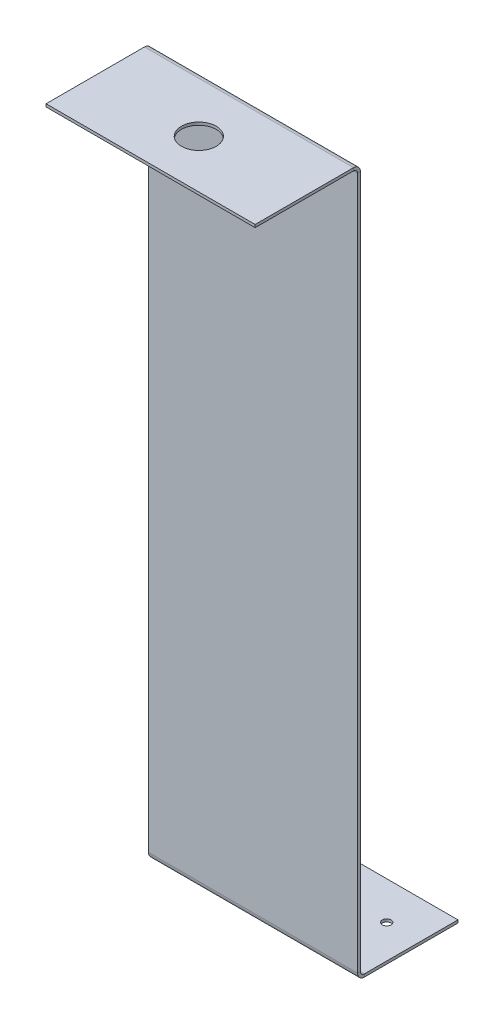
ISO-10303-21;
HEADER;
FILE_DESCRIPTION(('STEP AP214'),'2;1');
FILE_NAME('part.step','',(''),(''),'','','');
FILE_SCHEMA(('AUTOMOTIVE_DESIGN { 1 0 10303 214 1 1 1 1 }'));
ENDSEC;
DATA;
#1=APPLICATION_CONTEXT('core data for automotive mechanical design processes');
#2=APPLICATION_PROTOCOL_DEFINITION('international standard','automotive_design',2000,#1);
#3=PRODUCT_CONTEXT('',#1,'mechanical');
#4=PRODUCT('Part','Part','',(#3));
#5=PRODUCT_RELATED_PRODUCT_CATEGORY('part','',(#4));
#6=PRODUCT_DEFINITION_FORMATION('','',#4);
#7=PRODUCT_DEFINITION_CONTEXT('part definition',#1,'design');
#8=PRODUCT_DEFINITION('design','',#6,#7);
#9=PRODUCT_DEFINITION_SHAPE('','',#8);
#10=(LENGTH_UNIT() NAMED_UNIT(*) SI_UNIT(.MILLI.,.METRE.));
#11=(NAMED_UNIT(*) PLANE_ANGLE_UNIT() SI_UNIT($,.RADIAN.));
#12=(NAMED_UNIT(*) SI_UNIT($,.STERADIAN.) SOLID_ANGLE_UNIT());
#13=UNCERTAINTY_MEASURE_WITH_UNIT(LENGTH_MEASURE(1.E-05),#10,'distance_accuracy_value','');
#14=(GEOMETRIC_REPRESENTATION_CONTEXT(3) GLOBAL_UNCERTAINTY_ASSIGNED_CONTEXT((#13)) GLOBAL_UNIT_ASSIGNED_CONTEXT((#10,
#11,#12)) REPRESENTATION_CONTEXT('',''));
#15=CARTESIAN_POINT('',(0.,0.,0.));
#16=DIRECTION('',(0.,0.,1.));
#17=DIRECTION('',(1.,0.,0.));
#18=AXIS2_PLACEMENT_3D('',#15,#16,#17);
#19=CARTESIAN_POINT('',(-19.0500000000001,51.5620000000003,75.7803383173531));
#20=DIRECTION('',(0.,0.,1.));
#21=DIRECTION('',(0.,-1.,0.));
#22=AXIS2_PLACEMENT_3D('',#19,#20,#21);
#23=PLANE('',#22);
#24=DIRECTION('',(1.,0.,0.));
#25=VECTOR('',#24,1.);
#26=CARTESIAN_POINT('',(-19.0500000000001,52.0700000000003,75.7803383173531));
#27=LINE('',#26,#25);
#28=CARTESIAN_POINT('',(-19.0500000000001,52.0700000000003,75.7803383173531));
#29=VERTEX_POINT('',#28);
#30=CARTESIAN_POINT('',(19.0499999999999,52.0700000000003,75.7803383173531));
#31=VERTEX_POINT('',#30);
#32=EDGE_CURVE('E299',#29,#31,#27,.T.);
#33=ORIENTED_EDGE('',*,*,#32,.F.);
#34=DIRECTION('',(0.,1.,0.));
#35=VECTOR('',#34,1.);
#36=CARTESIAN_POINT('',(-19.0500000000001,51.5620000000003,75.7803383173531));
#37=LINE('',#36,#35);
#38=CARTESIAN_POINT('',(-19.0500000000001,51.5620000000003,75.7803383173531));
#39=VERTEX_POINT('',#38);
#40=EDGE_CURVE('E284',#39,#29,#37,.T.);
#41=ORIENTED_EDGE('',*,*,#40,.F.);
#42=DIRECTION('',(1.,0.,0.));
#43=VECTOR('',#42,1.);
#44=CARTESIAN_POINT('',(-19.0500000000001,51.5620000000003,75.7803383173531));
#45=LINE('',#44,#43);
#46=CARTESIAN_POINT('',(19.0499999999999,51.5620000000003,75.7803383173531));
#47=VERTEX_POINT('',#46);
#48=EDGE_CURVE('E312',#39,#47,#45,.T.);
#49=ORIENTED_EDGE('',*,*,#48,.T.);
#50=DIRECTION('',(0.,1.,0.));
#51=VECTOR('',#50,1.);
#52=CARTESIAN_POINT('',(19.0499999999999,51.5620000000003,75.7803383173531));
#53=LINE('',#52,#51);
#54=EDGE_CURVE('E311',#47,#31,#53,.T.);
#55=ORIENTED_EDGE('',*,*,#54,.T.);
#56=EDGE_LOOP('',(#33,#41,#49,#55));
#57=FACE_BOUND('',#56,.T.);
#58=ADVANCED_FACE('F67',(#57),#23,.T.);
#59=CARTESIAN_POINT('',(0.,51.5619999999993,-203.619661682647));
#60=DIRECTION('',(0.,-1.,0.));
#61=DIRECTION('',(-1.,0.,0.));
#62=AXIS2_PLACEMENT_3D('',#59,#60,#61);
#63=PLANE('',#62);
#64=CARTESIAN_POINT('',(0.,51.5620000000003,66.9891845793376));
#65=DIRECTION('',(0.,-1.,0.));
#66=DIRECTION('',(0.,0.,-1.));
#67=AXIS2_PLACEMENT_3D('',#64,#65,#66);
#68=CIRCLE('',#67,3.175);
#69=CARTESIAN_POINT('',(0.,51.5620000000002,63.8141845793376));
#70=VERTEX_POINT('',#69);
#71=EDGE_CURVE('E169',#70,#70,#68,.T.);
#72=ORIENTED_EDGE('',*,*,#71,.F.);
#73=EDGE_LOOP('',(#72));
#74=FACE_BOUND('',#73,.T.);
#75=DIRECTION('',(0.,0.,1.));
#76=VECTOR('',#75,1.);
#77=CARTESIAN_POINT('',(-19.0500000000001,51.5620000000003,75.7803383173531));
#78=LINE('',#77,#76);
#79=CARTESIAN_POINT('',(-19.0500000000001,51.5620000000002,57.8451845793376));
#80=VERTEX_POINT('',#79);
#81=EDGE_CURVE('E286',#80,#39,#78,.T.);
#82=ORIENTED_EDGE('',*,*,#81,.F.);
#83=DIRECTION('',(1.,0.,0.));
#84=VECTOR('',#83,1.);
#85=CARTESIAN_POINT('',(1.67542816975816E-13,51.5620000000002,57.8451845793376));
#86=LINE('',#85,#84);
#87=CARTESIAN_POINT('',(19.0499999999999,51.5620000000002,57.8451845793376));
#88=VERTEX_POINT('',#87);
#89=EDGE_CURVE('E275',#80,#88,#86,.T.);
#90=ORIENTED_EDGE('',*,*,#89,.T.);
#91=DIRECTION('',(0.,0.,-1.));
#92=VECTOR('',#91,1.);
#93=CARTESIAN_POINT('',(19.0499999999999,51.5620000000003,75.7803383173531));
#94=LINE('',#93,#92);
#95=EDGE_CURVE('E307',#47,#88,#94,.T.);
#96=ORIENTED_EDGE('',*,*,#95,.F.);
#97=ORIENTED_EDGE('',*,*,#48,.F.);
#98=EDGE_LOOP('',(#82,#90,#96,#97));
#99=FACE_BOUND('',#98,.T.);
#100=ADVANCED_FACE('F364',(#74,#99),#63,.T.);
#101=CARTESIAN_POINT('',(19.0499999999999,51.5620000000003,75.7803383173531));
#102=DIRECTION('',(1.,0.,0.));
#103=DIRECTION('',(0.,-1.,0.));
#104=AXIS2_PLACEMENT_3D('',#101,#102,#103);
#105=PLANE('',#104);
#106=ORIENTED_EDGE('',*,*,#95,.T.);
#107=DIRECTION('',(0.,1.,0.));
#108=VECTOR('',#107,1.);
#109=CARTESIAN_POINT('',(19.0499999999999,51.5620000000003,57.8451845793376));
#110=LINE('',#109,#108);
#111=CARTESIAN_POINT('',(19.0499999999999,52.0700000000002,57.8451845793376));
#112=VERTEX_POINT('',#111);
#113=EDGE_CURVE('E304',#88,#112,#110,.T.);
#114=ORIENTED_EDGE('',*,*,#113,.T.);
#115=DIRECTION('',(0.,0.,-1.));
#116=VECTOR('',#115,1.);
#117=CARTESIAN_POINT('',(19.0499999999999,52.0700000000003,75.7803383173531));
#118=LINE('',#117,#116);
#119=EDGE_CURVE('E297',#31,#112,#118,.T.);
#120=ORIENTED_EDGE('',*,*,#119,.F.);
#121=ORIENTED_EDGE('',*,*,#54,.F.);
#122=EDGE_LOOP('',(#106,#114,#120,#121));
#123=FACE_BOUND('',#122,.T.);
#124=ADVANCED_FACE('F369',(#123),#105,.T.);
#125=CARTESIAN_POINT('',(-19.0500000000001,51.5620000000003,75.7803383173531));
#126=DIRECTION('',(-1.,0.,0.));
#127=DIRECTION('',(0.,1.,0.));
#128=AXIS2_PLACEMENT_3D('',#125,#126,#127);
#129=PLANE('',#128);
#130=DIRECTION('',(0.,0.,1.));
#131=VECTOR('',#130,1.);
#132=CARTESIAN_POINT('',(-19.0500000000001,52.0700000000003,75.7803383173531));
#133=LINE('',#132,#131);
#134=CARTESIAN_POINT('',(-19.0500000000001,52.0700000000002,57.8451845793376));
#135=VERTEX_POINT('',#134);
#136=EDGE_CURVE('E302',#135,#29,#133,.T.);
#137=ORIENTED_EDGE('',*,*,#136,.F.);
#138=DIRECTION('',(0.,-1.,0.));
#139=VECTOR('',#138,1.);
#140=CARTESIAN_POINT('',(-19.0500000000001,51.5620000000004,57.8451845793376));
#141=LINE('',#140,#139);
#142=EDGE_CURVE('E291',#135,#80,#141,.T.);
#143=ORIENTED_EDGE('',*,*,#142,.T.);
#144=ORIENTED_EDGE('',*,*,#81,.T.);
#145=ORIENTED_EDGE('',*,*,#40,.T.);
#146=EDGE_LOOP('',(#137,#143,#144,#145));
#147=FACE_BOUND('',#146,.T.);
#148=ADVANCED_FACE('F375',(#147),#129,.T.);
#149=CARTESIAN_POINT('',(0.,52.0699999999993,-203.619661682647));
#150=DIRECTION('',(0.,-1.,0.));
#151=DIRECTION('',(-1.,0.,0.));
#152=AXIS2_PLACEMENT_3D('',#149,#150,#151);
#153=PLANE('',#152);
#154=CARTESIAN_POINT('',(0.,52.0700000000004,66.9891845793376));
#155=DIRECTION('',(0.,1.,0.));
#156=DIRECTION('',(0.,0.,1.));
#157=AXIS2_PLACEMENT_3D('',#154,#155,#156);
#158=CIRCLE('',#157,3.175);
#159=CARTESIAN_POINT('',(0.,52.0700000000004,70.1641845793376));
#160=VERTEX_POINT('',#159);
#161=EDGE_CURVE('E330',#160,#160,#158,.T.);
#162=ORIENTED_EDGE('',*,*,#161,.F.);
#163=EDGE_LOOP('',(#162));
#164=FACE_BOUND('',#163,.T.);
#165=DIRECTION('',(1.,0.,0.));
#166=VECTOR('',#165,1.);
#167=CARTESIAN_POINT('',(1.67727854146586E-13,52.0700000000002,57.8451845793376));
#168=LINE('',#167,#166);
#169=EDGE_CURVE('E281',#135,#112,#168,.T.);
#170=ORIENTED_EDGE('',*,*,#169,.F.);
#171=ORIENTED_EDGE('',*,*,#136,.T.);
#172=ORIENTED_EDGE('',*,*,#32,.T.);
#173=ORIENTED_EDGE('',*,*,#119,.T.);
#174=EDGE_LOOP('',(#170,#171,#172,#173));
#175=FACE_BOUND('',#174,.T.);
#176=ADVANCED_FACE('F377',(#164,#175),#153,.F.);
#177=CARTESIAN_POINT('',(38.1351451548194,50.8254000000002,57.8451845793375));
#178=DIRECTION('',(-1.,0.,0.));
#179=DIRECTION('',(0.,0.,1.));
#180=AXIS2_PLACEMENT_3D('',#177,#178,#179);
#181=CYLINDRICAL_SURFACE('',#180,0.7366);
#182=DIRECTION('',(1.,0.,0.));
#183=VECTOR('',#182,1.);
#184=CARTESIAN_POINT('',(1.6780679187286E-13,50.8254000000002,57.1085845793376));
#185=LINE('',#184,#183);
#186=CARTESIAN_POINT('',(-19.0500000000001,50.8254000000002,57.1085845793376));
#187=VERTEX_POINT('',#186);
#188=CARTESIAN_POINT('',(19.0499999999999,50.8254000000002,57.1085845793376));
#189=VERTEX_POINT('',#188);
#190=EDGE_CURVE('E182',#187,#189,#185,.T.);
#191=ORIENTED_EDGE('',*,*,#190,.T.);
#192=CARTESIAN_POINT('',(19.0499999999999,50.8254000000002,57.8451845793376));
#193=DIRECTION('',(1.,0.,0.));
#194=DIRECTION('',(0.,0.,1.));
#195=AXIS2_PLACEMENT_3D('',#192,#193,#194);
#196=CIRCLE('',#195,0.736599999999997);
#197=EDGE_CURVE('E220',#189,#88,#196,.T.);
#198=ORIENTED_EDGE('',*,*,#197,.T.);
#199=ORIENTED_EDGE('',*,*,#89,.F.);
#200=CARTESIAN_POINT('',(-19.0500000000001,50.8254000000002,57.8451845793376));
#201=DIRECTION('',(-1.,0.,0.));
#202=DIRECTION('',(0.,0.,-1.));
#203=AXIS2_PLACEMENT_3D('',#200,#201,#202);
#204=CIRCLE('',#203,0.736599999999993);
#205=EDGE_CURVE('E269',#80,#187,#204,.T.);
#206=ORIENTED_EDGE('',*,*,#205,.T.);
#207=EDGE_LOOP('',(#191,#198,#199,#206));
#208=FACE_BOUND('',#207,.T.);
#209=ADVANCED_FACE('F274',(#208),#181,.F.);
#210=CARTESIAN_POINT('',(19.0499999999999,50.8254000000002,57.8451845793376));
#211=DIRECTION('',(-1.,0.,0.));
#212=DIRECTION('',(0.,0.,1.));
#213=AXIS2_PLACEMENT_3D('',#210,#211,#212);
#214=PLANE('',#213);
#215=CARTESIAN_POINT('',(19.0499999999999,50.8254000000002,57.8451845793376));
#216=DIRECTION('',(-1.,0.,0.));
#217=DIRECTION('',(0.,0.,1.));
#218=AXIS2_PLACEMENT_3D('',#215,#216,#217);
#219=CIRCLE('',#218,1.2446);
#220=CARTESIAN_POINT('',(19.0499999999999,50.8254000000002,56.6005845793376));
#221=VERTEX_POINT('',#220);
#222=EDGE_CURVE('E276',#221,#112,#219,.F.);
#223=ORIENTED_EDGE('',*,*,#222,.T.);
#224=ORIENTED_EDGE('',*,*,#113,.F.);
#225=ORIENTED_EDGE('',*,*,#197,.F.);
#226=DIRECTION('',(0.,0.,-1.));
#227=VECTOR('',#226,1.);
#228=CARTESIAN_POINT('',(19.0499999999999,50.8254000000002,57.1085845793374));
#229=LINE('',#228,#227);
#230=EDGE_CURVE('E185',#189,#221,#229,.T.);
#231=ORIENTED_EDGE('',*,*,#230,.T.);
#232=EDGE_LOOP('',(#223,#224,#225,#231));
#233=FACE_BOUND('',#232,.T.);
#234=ADVANCED_FACE('F385',(#233),#214,.F.);
#235=CARTESIAN_POINT('',(-19.0500000000001,50.8254000000002,57.8451845793376));
#236=DIRECTION('',(1.,0.,0.));
#237=DIRECTION('',(0.,0.,-1.));
#238=AXIS2_PLACEMENT_3D('',#235,#236,#237);
#239=PLANE('',#238);
#240=ORIENTED_EDGE('',*,*,#142,.F.);
#241=CARTESIAN_POINT('',(-19.0500000000001,50.8254000000002,57.8451845793376));
#242=DIRECTION('',(-1.,0.,0.));
#243=DIRECTION('',(0.,0.,1.));
#244=AXIS2_PLACEMENT_3D('',#241,#242,#243);
#245=CIRCLE('',#244,1.2446);
#246=CARTESIAN_POINT('',(-19.0500000000001,50.8254000000002,56.6005845793376));
#247=VERTEX_POINT('',#246);
#248=EDGE_CURVE('E271',#135,#247,#245,.T.);
#249=ORIENTED_EDGE('',*,*,#248,.T.);
#250=DIRECTION('',(0.,0.,1.));
#251=VECTOR('',#250,1.);
#252=CARTESIAN_POINT('',(-19.0500000000001,50.8254000000002,57.1085845793375));
#253=LINE('',#252,#251);
#254=EDGE_CURVE('E75',#247,#187,#253,.T.);
#255=ORIENTED_EDGE('',*,*,#254,.T.);
#256=ORIENTED_EDGE('',*,*,#205,.F.);
#257=EDGE_LOOP('',(#240,#249,#255,#256));
#258=FACE_BOUND('',#257,.T.);
#259=ADVANCED_FACE('F268',(#258),#239,.F.);
#260=CARTESIAN_POINT('',(38.1351451548194,50.8254000000002,57.8451845793375));
#261=DIRECTION('',(-1.,0.,0.));
#262=DIRECTION('',(0.,0.,1.));
#263=AXIS2_PLACEMENT_3D('',#260,#261,#262);
#264=CYLINDRICAL_SURFACE('',#263,1.2446);
#265=DIRECTION('',(1.,0.,0.));
#266=VECTOR('',#265,1.);
#267=CARTESIAN_POINT('',(1.67529236116704E-13,50.8254000000002,56.6005845793376));
#268=LINE('',#267,#266);
#269=EDGE_CURVE('E189',#247,#221,#268,.T.);
#270=ORIENTED_EDGE('',*,*,#269,.F.);
#271=ORIENTED_EDGE('',*,*,#248,.F.);
#272=ORIENTED_EDGE('',*,*,#169,.T.);
#273=ORIENTED_EDGE('',*,*,#222,.F.);
#274=EDGE_LOOP('',(#270,#271,#272,#273));
#275=FACE_BOUND('',#274,.T.);
#276=ADVANCED_FACE('F386',(#275),#264,.T.);
#277=CARTESIAN_POINT('',(0.,-209.083415420661,57.1085845793394));
#278=DIRECTION('',(0.,0.,1.));
#279=DIRECTION('',(-1.,0.,0.));
#280=AXIS2_PLACEMENT_3D('',#277,#278,#279);
#281=PLANE('',#280);
#282=ORIENTED_EDGE('',*,*,#190,.F.);
#283=DIRECTION('',(0.,1.,0.));
#284=VECTOR('',#283,1.);
#285=CARTESIAN_POINT('',(-19.0500000000001,70.3165845793387,57.1085845793375));
#286=LINE('',#285,#284);
#287=CARTESIAN_POINT('',(-19.05,-75.4219845793383,57.1085845793385));
#288=VERTEX_POINT('',#287);
#289=EDGE_CURVE('E193',#288,#187,#286,.T.);
#290=ORIENTED_EDGE('',*,*,#289,.F.);
#291=DIRECTION('',(-1.,0.,0.));
#292=VECTOR('',#291,1.);
#293=CARTESIAN_POINT('',(0.,-75.4219845793383,57.1085845793385));
#294=LINE('',#293,#292);
#295=CARTESIAN_POINT('',(19.05,-75.4219845793383,57.1085845793385));
#296=VERTEX_POINT('',#295);
#297=EDGE_CURVE('E213',#296,#288,#294,.T.);
#298=ORIENTED_EDGE('',*,*,#297,.F.);
#299=DIRECTION('',(0.,-1.,0.));
#300=VECTOR('',#299,1.);
#301=CARTESIAN_POINT('',(19.0499999999999,70.3165845793387,57.1085845793374));
#302=LINE('',#301,#300);
#303=EDGE_CURVE('E199',#189,#296,#302,.T.);
#304=ORIENTED_EDGE('',*,*,#303,.F.);
#305=EDGE_LOOP('',(#282,#290,#298,#304));
#306=FACE_BOUND('',#305,.T.);
#307=ADVANCED_FACE('F259',(#306),#281,.T.);
#308=CARTESIAN_POINT('',(19.0499999999999,70.3165845793387,57.1085845793374));
#309=DIRECTION('',(1.,0.,0.));
#310=DIRECTION('',(0.,0.,1.));
#311=AXIS2_PLACEMENT_3D('',#308,#309,#310);
#312=PLANE('',#311);
#313=ORIENTED_EDGE('',*,*,#230,.F.);
#314=ORIENTED_EDGE('',*,*,#303,.T.);
#315=DIRECTION('',(0.,0.,1.));
#316=VECTOR('',#315,1.);
#317=CARTESIAN_POINT('',(19.05,-75.4219845793383,57.1085845793384));
#318=LINE('',#317,#316);
#319=CARTESIAN_POINT('',(19.05,-75.4219845793383,56.6005845793385));
#320=VERTEX_POINT('',#319);
#321=EDGE_CURVE('E200',#320,#296,#318,.T.);
#322=ORIENTED_EDGE('',*,*,#321,.F.);
#323=DIRECTION('',(0.,-1.,0.));
#324=VECTOR('',#323,1.);
#325=CARTESIAN_POINT('',(19.0499999999999,70.3165845793387,56.6005845793374));
#326=LINE('',#325,#324);
#327=EDGE_CURVE('E196',#221,#320,#326,.T.);
#328=ORIENTED_EDGE('',*,*,#327,.F.);
#329=EDGE_LOOP('',(#313,#314,#322,#328));
#330=FACE_BOUND('',#329,.T.);
#331=ADVANCED_FACE('F410',(#330),#312,.T.);
#332=CARTESIAN_POINT('',(-19.0500000000001,70.3165845793387,57.1085845793375));
#333=DIRECTION('',(-1.,0.,0.));
#334=DIRECTION('',(0.,0.,-1.));
#335=AXIS2_PLACEMENT_3D('',#332,#333,#334);
#336=PLANE('',#335);
#337=ORIENTED_EDGE('',*,*,#254,.F.);
#338=DIRECTION('',(0.,1.,0.));
#339=VECTOR('',#338,1.);
#340=CARTESIAN_POINT('',(-19.0500000000001,70.3165845793387,56.6005845793375));
#341=LINE('',#340,#339);
#342=CARTESIAN_POINT('',(-19.05,-75.4219845793383,56.6005845793385));
#343=VERTEX_POINT('',#342);
#344=EDGE_CURVE('E89',#343,#247,#341,.T.);
#345=ORIENTED_EDGE('',*,*,#344,.F.);
#346=DIRECTION('',(0.,0.,-1.));
#347=VECTOR('',#346,1.);
#348=CARTESIAN_POINT('',(-19.05,-75.4219845793383,57.1085845793385));
#349=LINE('',#348,#347);
#350=EDGE_CURVE('E206',#288,#343,#349,.T.);
#351=ORIENTED_EDGE('',*,*,#350,.F.);
#352=ORIENTED_EDGE('',*,*,#289,.T.);
#353=EDGE_LOOP('',(#337,#345,#351,#352));
#354=FACE_BOUND('',#353,.T.);
#355=ADVANCED_FACE('F69',(#354),#336,.T.);
#356=CARTESIAN_POINT('',(0.,-209.083415420661,56.6005845793394));
#357=DIRECTION('',(0.,0.,1.));
#358=DIRECTION('',(-1.,0.,0.));
#359=AXIS2_PLACEMENT_3D('',#356,#357,#358);
#360=PLANE('',#359);
#361=ORIENTED_EDGE('',*,*,#344,.T.);
#362=ORIENTED_EDGE('',*,*,#269,.T.);
#363=ORIENTED_EDGE('',*,*,#327,.T.);
#364=DIRECTION('',(-1.,0.,0.));
#365=VECTOR('',#364,1.);
#366=CARTESIAN_POINT('',(0.,-75.4219845793383,56.6005845793385));
#367=LINE('',#366,#365);
#368=EDGE_CURVE('E198',#320,#343,#367,.T.);
#369=ORIENTED_EDGE('',*,*,#368,.T.);
#370=EDGE_LOOP('',(#361,#362,#363,#369));
#371=FACE_BOUND('',#370,.T.);
#372=ADVANCED_FACE('F254',(#371),#360,.F.);
#373=CARTESIAN_POINT('',(38.1351451548194,-75.4219845793383,55.8639845793384));
#374=DIRECTION('',(-1.,0.,0.));
#375=DIRECTION('',(0.,0.,1.));
#376=AXIS2_PLACEMENT_3D('',#373,#374,#375);
#377=CYLINDRICAL_SURFACE('',#376,1.2446);
#378=ORIENTED_EDGE('',*,*,#297,.T.);
#379=CARTESIAN_POINT('',(-19.05,-75.4219845793383,55.8639845793385));
#380=DIRECTION('',(1.,0.,0.));
#381=DIRECTION('',(0.,0.,1.));
#382=AXIS2_PLACEMENT_3D('',#379,#380,#381);
#383=CIRCLE('',#382,1.2446);
#384=CARTESIAN_POINT('',(-19.05,-76.6665845793383,55.8639845793385));
#385=VERTEX_POINT('',#384);
#386=EDGE_CURVE('E178',#288,#385,#383,.T.);
#387=ORIENTED_EDGE('',*,*,#386,.T.);
#388=DIRECTION('',(-1.,0.,0.));
#389=VECTOR('',#388,1.);
#390=CARTESIAN_POINT('',(0.,-76.6665845793383,55.8639845793385));
#391=LINE('',#390,#389);
#392=CARTESIAN_POINT('',(19.05,-76.6665845793383,55.8639845793385));
#393=VERTEX_POINT('',#392);
#394=EDGE_CURVE('E229',#393,#385,#391,.T.);
#395=ORIENTED_EDGE('',*,*,#394,.F.);
#396=CARTESIAN_POINT('',(19.05,-75.4219845793383,55.8639845793385));
#397=DIRECTION('',(-1.,0.,0.));
#398=DIRECTION('',(0.,0.,-1.));
#399=AXIS2_PLACEMENT_3D('',#396,#397,#398);
#400=CIRCLE('',#399,1.2446);
#401=EDGE_CURVE('E221',#393,#296,#400,.T.);
#402=ORIENTED_EDGE('',*,*,#401,.T.);
#403=EDGE_LOOP('',(#378,#387,#395,#402));
#404=FACE_BOUND('',#403,.T.);
#405=ADVANCED_FACE('F246',(#404),#377,.T.);
#406=CARTESIAN_POINT('',(19.05,-75.4219845793383,55.8639845793385));
#407=DIRECTION('',(1.,0.,0.));
#408=DIRECTION('',(0.,0.,-1.));
#409=AXIS2_PLACEMENT_3D('',#406,#407,#408);
#410=PLANE('',#409);
#411=DIRECTION('',(0.,-1.,0.));
#412=VECTOR('',#411,1.);
#413=CARTESIAN_POINT('',(19.05,-76.6665845793383,55.8639845793385));
#414=LINE('',#413,#412);
#415=CARTESIAN_POINT('',(19.05,-76.1585845793383,55.8639845793385));
#416=VERTEX_POINT('',#415);
#417=EDGE_CURVE('E232',#416,#393,#414,.T.);
#418=ORIENTED_EDGE('',*,*,#417,.F.);
#419=CARTESIAN_POINT('',(19.05,-75.4219845793383,55.8639845793385));
#420=DIRECTION('',(-1.,0.,0.));
#421=DIRECTION('',(0.,0.,1.));
#422=AXIS2_PLACEMENT_3D('',#419,#420,#421);
#423=CIRCLE('',#422,0.7366);
#424=EDGE_CURVE('E195',#416,#320,#423,.T.);
#425=ORIENTED_EDGE('',*,*,#424,.T.);
#426=ORIENTED_EDGE('',*,*,#321,.T.);
#427=ORIENTED_EDGE('',*,*,#401,.F.);
#428=EDGE_LOOP('',(#418,#425,#426,#427));
#429=FACE_BOUND('',#428,.T.);
#430=ADVANCED_FACE('F250',(#429),#410,.T.);
#431=CARTESIAN_POINT('',(-19.05,-75.4219845793383,55.8639845793385));
#432=DIRECTION('',(-1.,0.,0.));
#433=DIRECTION('',(0.,0.,1.));
#434=AXIS2_PLACEMENT_3D('',#431,#432,#433);
#435=PLANE('',#434);
#436=CARTESIAN_POINT('',(-19.05,-75.4219845793383,55.8639845793385));
#437=DIRECTION('',(-1.,0.,0.));
#438=DIRECTION('',(0.,0.,1.));
#439=AXIS2_PLACEMENT_3D('',#436,#437,#438);
#440=CIRCLE('',#439,0.7366);
#441=CARTESIAN_POINT('',(-19.05,-76.1585845793383,55.8639845793385));
#442=VERTEX_POINT('',#441);
#443=EDGE_CURVE('E223',#343,#442,#440,.F.);
#444=ORIENTED_EDGE('',*,*,#443,.T.);
#445=DIRECTION('',(0.,1.,0.));
#446=VECTOR('',#445,1.);
#447=CARTESIAN_POINT('',(-19.05,-76.6665845793383,55.8639845793385));
#448=LINE('',#447,#446);
#449=EDGE_CURVE('E186',#385,#442,#448,.T.);
#450=ORIENTED_EDGE('',*,*,#449,.F.);
#451=ORIENTED_EDGE('',*,*,#386,.F.);
#452=ORIENTED_EDGE('',*,*,#350,.T.);
#453=EDGE_LOOP('',(#444,#450,#451,#452));
#454=FACE_BOUND('',#453,.T.);
#455=ADVANCED_FACE('F243',(#454),#435,.T.);
#456=CARTESIAN_POINT('',(38.1351451548194,-75.4219845793383,55.8639845793384));
#457=DIRECTION('',(-1.,0.,0.));
#458=DIRECTION('',(0.,0.,1.));
#459=AXIS2_PLACEMENT_3D('',#456,#457,#458);
#460=CYLINDRICAL_SURFACE('',#459,0.7366);
#461=ORIENTED_EDGE('',*,*,#368,.F.);
#462=ORIENTED_EDGE('',*,*,#424,.F.);
#463=DIRECTION('',(-1.,0.,0.));
#464=VECTOR('',#463,1.);
#465=CARTESIAN_POINT('',(0.,-76.1585845793383,55.8639845793385));
#466=LINE('',#465,#464);
#467=EDGE_CURVE('E173',#416,#442,#466,.T.);
#468=ORIENTED_EDGE('',*,*,#467,.T.);
#469=ORIENTED_EDGE('',*,*,#443,.F.);
#470=EDGE_LOOP('',(#461,#462,#468,#469));
#471=FACE_BOUND('',#470,.T.);
#472=ADVANCED_FACE('F253',(#471),#460,.F.);
#473=CARTESIAN_POINT('',(0.,-76.1585845793388,-76.2414154206615));
#474=DIRECTION('',(0.,-1.,0.));
#475=DIRECTION('',(-1.,0.,0.));
#476=AXIS2_PLACEMENT_3D('',#473,#474,#475);
#477=PLANE('',#476);
#478=CARTESIAN_POINT('',(12.954,-76.1585845793383,45.7039845793385));
#479=DIRECTION('',(0.,-1.,0.));
#480=DIRECTION('',(0.,0.,-1.));
#481=AXIS2_PLACEMENT_3D('',#478,#479,#480);
#482=CIRCLE('',#481,0.793749999999999);
#483=CARTESIAN_POINT('',(12.954,-76.1585845793383,44.9102345793385));
#484=VERTEX_POINT('',#483);
#485=EDGE_CURVE('E323',#484,#484,#482,.T.);
#486=ORIENTED_EDGE('',*,*,#485,.T.);
#487=EDGE_LOOP('',(#486));
#488=FACE_BOUND('',#487,.T.);
#489=CARTESIAN_POINT('',(-12.7,-76.1585845793383,49.5139845793385));
#490=DIRECTION('',(0.,-1.,0.));
#491=DIRECTION('',(0.,0.,-1.));
#492=AXIS2_PLACEMENT_3D('',#489,#490,#491);
#493=CIRCLE('',#492,3.175);
#494=CARTESIAN_POINT('',(-12.7,-76.1585845793383,46.3389845793385));
#495=VERTEX_POINT('',#494);
#496=EDGE_CURVE('E326',#495,#495,#493,.T.);
#497=ORIENTED_EDGE('',*,*,#496,.T.);
#498=EDGE_LOOP('',(#497));
#499=FACE_BOUND('',#498,.T.);
#500=DIRECTION('',(0.,0.,-1.));
#501=VECTOR('',#500,1.);
#502=CARTESIAN_POINT('',(19.05,-76.1585845793378,203.158584579339));
#503=LINE('',#502,#501);
#504=CARTESIAN_POINT('',(19.05,-76.1585845793384,38.8205845793385));
#505=VERTEX_POINT('',#504);
#506=EDGE_CURVE('E165',#416,#505,#503,.T.);
#507=ORIENTED_EDGE('',*,*,#506,.T.);
#508=DIRECTION('',(-1.,0.,0.));
#509=VECTOR('',#508,1.);
#510=CARTESIAN_POINT('',(0.,-76.1585845793384,38.8205845793385));
#511=LINE('',#510,#509);
#512=CARTESIAN_POINT('',(-19.05,-76.1585845793384,38.8205845793385));
#513=VERTEX_POINT('',#512);
#514=EDGE_CURVE('E12',#505,#513,#511,.T.);
#515=ORIENTED_EDGE('',*,*,#514,.T.);
#516=DIRECTION('',(0.,0.,1.));
#517=VECTOR('',#516,1.);
#518=CARTESIAN_POINT('',(-19.05,-76.1585845793378,203.158584579339));
#519=LINE('',#518,#517);
#520=EDGE_CURVE('E174',#513,#442,#519,.T.);
#521=ORIENTED_EDGE('',*,*,#520,.T.);
#522=ORIENTED_EDGE('',*,*,#467,.F.);
#523=EDGE_LOOP('',(#507,#515,#521,#522));
#524=FACE_BOUND('',#523,.T.);
#525=ADVANCED_FACE('F171',(#488,#499,#524),#477,.F.);
#526=CARTESIAN_POINT('',(-19.05,-76.6665845793378,203.158584579339));
#527=DIRECTION('',(-1.,0.,0.));
#528=DIRECTION('',(0.,1.,0.));
#529=AXIS2_PLACEMENT_3D('',#526,#527,#528);
#530=PLANE('',#529);
#531=DIRECTION('',(0.,-1.,0.));
#532=VECTOR('',#531,1.);
#533=CARTESIAN_POINT('',(-19.0500000000001,132.935711652053,38.8205845793385));
#534=LINE('',#533,#532);
#535=CARTESIAN_POINT('',(-19.0500000000001,-76.6665845793385,38.8205845793385));
#536=VERTEX_POINT('',#535);
#537=EDGE_CURVE('E82',#513,#536,#534,.T.);
#538=ORIENTED_EDGE('',*,*,#537,.T.);
#539=DIRECTION('',(0.,0.,1.));
#540=VECTOR('',#539,1.);
#541=CARTESIAN_POINT('',(-19.05,-76.6665845793378,203.158584579339));
#542=LINE('',#541,#540);
#543=EDGE_CURVE('E176',#536,#385,#542,.T.);
#544=ORIENTED_EDGE('',*,*,#543,.T.);
#545=ORIENTED_EDGE('',*,*,#449,.T.);
#546=ORIENTED_EDGE('',*,*,#520,.F.);
#547=EDGE_LOOP('',(#538,#544,#545,#546));
#548=FACE_BOUND('',#547,.T.);
#549=ADVANCED_FACE('F239',(#548),#530,.T.);
#550=CARTESIAN_POINT('',(19.05,-76.6665845793378,203.158584579339));
#551=DIRECTION('',(1.,0.,0.));
#552=DIRECTION('',(0.,-1.,0.));
#553=AXIS2_PLACEMENT_3D('',#550,#551,#552);
#554=PLANE('',#553);
#555=DIRECTION('',(0.,-1.,0.));
#556=VECTOR('',#555,1.);
#557=CARTESIAN_POINT('',(19.05,132.935711652053,38.8205845793385));
#558=LINE('',#557,#556);
#559=CARTESIAN_POINT('',(19.05,-76.6665845793385,38.8205845793385));
#560=VERTEX_POINT('',#559);
#561=EDGE_CURVE('E155',#505,#560,#558,.T.);
#562=ORIENTED_EDGE('',*,*,#561,.F.);
#563=ORIENTED_EDGE('',*,*,#506,.F.);
#564=ORIENTED_EDGE('',*,*,#417,.T.);
#565=DIRECTION('',(0.,0.,-1.));
#566=VECTOR('',#565,1.);
#567=CARTESIAN_POINT('',(19.05,-76.6665845793378,203.158584579339));
#568=LINE('',#567,#566);
#569=EDGE_CURVE('E168',#393,#560,#568,.T.);
#570=ORIENTED_EDGE('',*,*,#569,.T.);
#571=EDGE_LOOP('',(#562,#563,#564,#570));
#572=FACE_BOUND('',#571,.T.);
#573=ADVANCED_FACE('F163',(#572),#554,.T.);
#574=CARTESIAN_POINT('',(0.,-76.6665845793388,-76.2414154206615));
#575=DIRECTION('',(0.,-1.,0.));
#576=DIRECTION('',(-1.,0.,0.));
#577=AXIS2_PLACEMENT_3D('',#574,#575,#576);
#578=PLANE('',#577);
#579=CARTESIAN_POINT('',(12.954,-76.6665845793386,45.7039845793385));
#580=DIRECTION('',(0.,1.,0.));
#581=DIRECTION('',(0.,0.,1.));
#582=AXIS2_PLACEMENT_3D('',#579,#580,#581);
#583=CIRCLE('',#582,0.793749999999999);
#584=CARTESIAN_POINT('',(12.954,-76.6665845793386,46.4977345793385));
#585=VERTEX_POINT('',#584);
#586=EDGE_CURVE('E329',#585,#585,#583,.T.);
#587=ORIENTED_EDGE('',*,*,#586,.T.);
#588=EDGE_LOOP('',(#587));
#589=FACE_BOUND('',#588,.T.);
#590=CARTESIAN_POINT('',(-12.7,-76.6665845793386,49.5139845793385));
#591=DIRECTION('',(0.,1.,0.));
#592=DIRECTION('',(0.,0.,1.));
#593=AXIS2_PLACEMENT_3D('',#590,#591,#592);
#594=CIRCLE('',#593,3.175);
#595=CARTESIAN_POINT('',(-12.7,-76.6665845793386,52.6889845793385));
#596=VERTEX_POINT('',#595);
#597=EDGE_CURVE('E333',#596,#596,#594,.T.);
#598=ORIENTED_EDGE('',*,*,#597,.T.);
#599=EDGE_LOOP('',(#598));
#600=FACE_BOUND('',#599,.T.);
#601=DIRECTION('',(-1.,0.,0.));
#602=VECTOR('',#601,1.);
#603=CARTESIAN_POINT('',(0.,-76.6665845793383,38.8205845793385));
#604=LINE('',#603,#602);
#605=EDGE_CURVE('E248',#560,#536,#604,.T.);
#606=ORIENTED_EDGE('',*,*,#605,.F.);
#607=ORIENTED_EDGE('',*,*,#569,.F.);
#608=ORIENTED_EDGE('',*,*,#394,.T.);
#609=ORIENTED_EDGE('',*,*,#543,.F.);
#610=EDGE_LOOP('',(#606,#607,#608,#609));
#611=FACE_BOUND('',#610,.T.);
#612=ADVANCED_FACE('F247',(#589,#600,#611),#578,.T.);
#613=CARTESIAN_POINT('',(-19.0500000000001,132.935711652053,38.8205845793385));
#614=DIRECTION('',(0.,0.,1.));
#615=DIRECTION('',(0.,-1.,0.));
#616=AXIS2_PLACEMENT_3D('',#613,#614,#615);
#617=PLANE('',#616);
#618=ORIENTED_EDGE('',*,*,#605,.T.);
#619=ORIENTED_EDGE('',*,*,#537,.F.);
#620=ORIENTED_EDGE('',*,*,#514,.F.);
#621=ORIENTED_EDGE('',*,*,#561,.T.);
#622=EDGE_LOOP('',(#618,#619,#620,#621));
#623=FACE_BOUND('',#622,.T.);
#624=ADVANCED_FACE('F154',(#623),#617,.F.);
#625=CARTESIAN_POINT('',(-12.7,-76.6665845793386,49.5139845793385));
#626=DIRECTION('',(0.,1.,0.));
#627=DIRECTION('',(0.,0.,1.));
#628=AXIS2_PLACEMENT_3D('',#625,#626,#627);
#629=CYLINDRICAL_SURFACE('',#628,3.175);
#630=ORIENTED_EDGE('',*,*,#597,.F.);
#631=EDGE_LOOP('',(#630));
#632=FACE_BOUND('',#631,.T.);
#633=ORIENTED_EDGE('',*,*,#496,.F.);
#634=EDGE_LOOP('',(#633));
#635=FACE_BOUND('',#634,.T.);
#636=ADVANCED_FACE('F345',(#632,#635),#629,.F.);
#637=CARTESIAN_POINT('',(12.954,-76.6665845793386,45.7039845793385));
#638=DIRECTION('',(0.,1.,0.));
#639=DIRECTION('',(0.,0.,1.));
#640=AXIS2_PLACEMENT_3D('',#637,#638,#639);
#641=CYLINDRICAL_SURFACE('',#640,0.793749999999999);
#642=ORIENTED_EDGE('',*,*,#586,.F.);
#643=EDGE_LOOP('',(#642));
#644=FACE_BOUND('',#643,.T.);
#645=ORIENTED_EDGE('',*,*,#485,.F.);
#646=EDGE_LOOP('',(#645));
#647=FACE_BOUND('',#646,.T.);
#648=ADVANCED_FACE('F341',(#644,#647),#641,.F.);
#649=CARTESIAN_POINT('',(0.,-76.6665845793385,66.989184579338));
#650=DIRECTION('',(0.,1.,0.));
#651=DIRECTION('',(0.,0.,1.));
#652=AXIS2_PLACEMENT_3D('',#649,#650,#651);
#653=CYLINDRICAL_SURFACE('',#652,3.175);
#654=ORIENTED_EDGE('',*,*,#71,.T.);
#655=EDGE_LOOP('',(#654));
#656=FACE_BOUND('',#655,.T.);
#657=ORIENTED_EDGE('',*,*,#161,.T.);
#658=EDGE_LOOP('',(#657));
#659=FACE_BOUND('',#658,.T.);
#660=ADVANCED_FACE('F344',(#656,#659),#653,.F.);
#661=CLOSED_SHELL('',(#58,#100,#124,#148,#176,#209,#234,#259,#276,#307,#331,#355,#372,#405,#430,
#455,#472,#525,#549,#573,#612,#624,#636,#648,#660));
#662=MANIFOLD_SOLID_BREP('B2',#661);
#663=ADVANCED_BREP_SHAPE_REPRESENTATION('',(#18,#662),#14);
#664=SHAPE_DEFINITION_REPRESENTATION(#9,#663);
ENDSEC;
END-ISO-10303-21;
